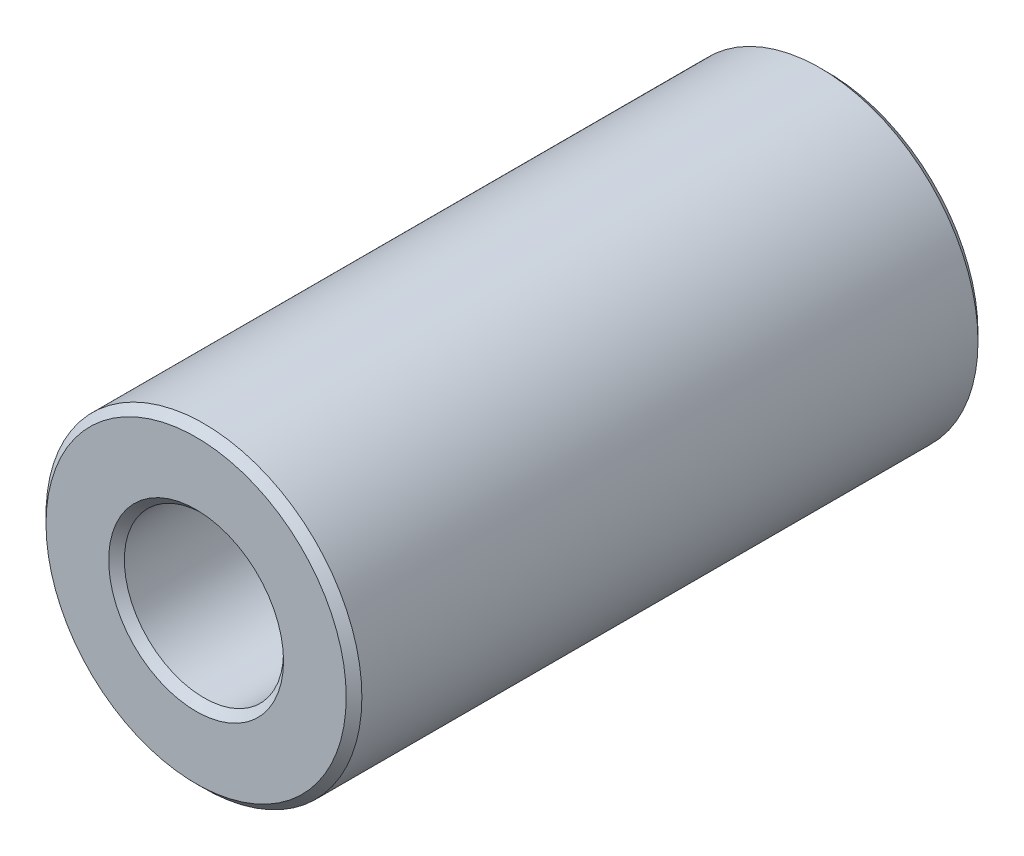
ISO-10303-21;
HEADER;
FILE_DESCRIPTION(('STEP AP214'),'2;1');
FILE_NAME('part.step','',(''),(''),'','','');
FILE_SCHEMA(('AUTOMOTIVE_DESIGN { 1 0 10303 214 1 1 1 1 }'));
ENDSEC;
DATA;
#1=APPLICATION_CONTEXT('core data for automotive mechanical design processes');
#2=APPLICATION_PROTOCOL_DEFINITION('international standard','automotive_design',2000,#1);
#3=PRODUCT_CONTEXT('',#1,'mechanical');
#4=PRODUCT('Part','Part','',(#3));
#5=PRODUCT_RELATED_PRODUCT_CATEGORY('part','',(#4));
#6=PRODUCT_DEFINITION_FORMATION('','',#4);
#7=PRODUCT_DEFINITION_CONTEXT('part definition',#1,'design');
#8=PRODUCT_DEFINITION('design','',#6,#7);
#9=PRODUCT_DEFINITION_SHAPE('','',#8);
#10=(LENGTH_UNIT() NAMED_UNIT(*) SI_UNIT(.MILLI.,.METRE.));
#11=(NAMED_UNIT(*) PLANE_ANGLE_UNIT() SI_UNIT($,.RADIAN.));
#12=(NAMED_UNIT(*) SI_UNIT($,.STERADIAN.) SOLID_ANGLE_UNIT());
#13=UNCERTAINTY_MEASURE_WITH_UNIT(LENGTH_MEASURE(1.E-05),#10,'distance_accuracy_value','');
#14=(GEOMETRIC_REPRESENTATION_CONTEXT(3) GLOBAL_UNCERTAINTY_ASSIGNED_CONTEXT((#13)) GLOBAL_UNIT_ASSIGNED_CONTEXT((#10,
#11,#12)) REPRESENTATION_CONTEXT('',''));
#15=CARTESIAN_POINT('',(0.,0.,0.));
#16=DIRECTION('',(0.,0.,1.));
#17=DIRECTION('',(1.,0.,0.));
#18=AXIS2_PLACEMENT_3D('',#15,#16,#17);
#19=CARTESIAN_POINT('',(0.,0.,-12.7));
#20=DIRECTION('',(0.,0.,1.));
#21=DIRECTION('',(1.,0.,0.));
#22=AXIS2_PLACEMENT_3D('',#19,#20,#21);
#23=CYLINDRICAL_SURFACE('',#22,6.35);
#24=CARTESIAN_POINT('',(0.,0.,12.38504));
#25=DIRECTION('',(0.,0.,1.));
#26=DIRECTION('',(1.,0.,0.));
#27=AXIS2_PLACEMENT_3D('',#24,#25,#26);
#28=CIRCLE('',#27,6.35);
#29=CARTESIAN_POINT('',(6.35,0.,12.38504));
#30=VERTEX_POINT('',#29);
#31=EDGE_CURVE('E55',#30,#30,#28,.F.);
#32=ORIENTED_EDGE('',*,*,#31,.T.);
#33=EDGE_LOOP('',(#32));
#34=FACE_BOUND('',#33,.T.);
#35=CARTESIAN_POINT('',(0.,0.,-12.38504));
#36=DIRECTION('',(0.,0.,1.));
#37=DIRECTION('',(1.,0.,0.));
#38=AXIS2_PLACEMENT_3D('',#35,#36,#37);
#39=CIRCLE('',#38,6.35);
#40=CARTESIAN_POINT('',(6.35,0.,-12.38504));
#41=VERTEX_POINT('',#40);
#42=EDGE_CURVE('E58',#41,#41,#39,.T.);
#43=ORIENTED_EDGE('',*,*,#42,.T.);
#44=EDGE_LOOP('',(#43));
#45=FACE_BOUND('',#44,.T.);
#46=ADVANCED_FACE('F35',(#34,#45),#23,.T.);
#47=CARTESIAN_POINT('',(0.,0.,-12.7));
#48=DIRECTION('',(0.,0.,1.));
#49=DIRECTION('',(1.,0.,0.));
#50=AXIS2_PLACEMENT_3D('',#47,#48,#49);
#51=PLANE('',#50);
#52=CARTESIAN_POINT('',(0.,0.,-12.7));
#53=DIRECTION('',(0.,0.,1.));
#54=DIRECTION('',(1.,0.,0.));
#55=AXIS2_PLACEMENT_3D('',#52,#53,#54);
#56=CIRCLE('',#55,6.03504);
#57=CARTESIAN_POINT('',(6.03504,0.,-12.7));
#58=VERTEX_POINT('',#57);
#59=EDGE_CURVE('E46',#58,#58,#56,.F.);
#60=ORIENTED_EDGE('',*,*,#59,.T.);
#61=EDGE_LOOP('',(#60));
#62=FACE_BOUND('',#61,.T.);
#63=CARTESIAN_POINT('',(0.,0.,-12.7));
#64=DIRECTION('',(0.,0.,1.));
#65=DIRECTION('',(1.,0.,0.));
#66=AXIS2_PLACEMENT_3D('',#63,#64,#65);
#67=CIRCLE('',#66,3.51536);
#68=CARTESIAN_POINT('',(3.51536,0.,-12.7));
#69=VERTEX_POINT('',#68);
#70=EDGE_CURVE('E50',#69,#69,#67,.T.);
#71=ORIENTED_EDGE('',*,*,#70,.T.);
#72=EDGE_LOOP('',(#71));
#73=FACE_BOUND('',#72,.T.);
#74=ADVANCED_FACE('F83',(#62,#73),#51,.F.);
#75=CARTESIAN_POINT('',(0.,0.,-12.7));
#76=DIRECTION('',(0.,0.,1.));
#77=DIRECTION('',(1.,0.,0.));
#78=AXIS2_PLACEMENT_3D('',#75,#76,#77);
#79=CYLINDRICAL_SURFACE('',#78,3.2004);
#80=CARTESIAN_POINT('',(0.,0.,12.38504));
#81=DIRECTION('',(0.,0.,1.));
#82=DIRECTION('',(1.,0.,0.));
#83=AXIS2_PLACEMENT_3D('',#80,#81,#82);
#84=CIRCLE('',#83,3.2004);
#85=CARTESIAN_POINT('',(3.2004,0.,12.38504));
#86=VERTEX_POINT('',#85);
#87=EDGE_CURVE('E10',#86,#86,#84,.T.);
#88=ORIENTED_EDGE('',*,*,#87,.T.);
#89=EDGE_LOOP('',(#88));
#90=FACE_BOUND('',#89,.T.);
#91=CARTESIAN_POINT('',(0.,0.,-12.38504));
#92=DIRECTION('',(0.,0.,1.));
#93=DIRECTION('',(1.,0.,0.));
#94=AXIS2_PLACEMENT_3D('',#91,#92,#93);
#95=CIRCLE('',#94,3.2004);
#96=CARTESIAN_POINT('',(3.2004,0.,-12.38504));
#97=VERTEX_POINT('',#96);
#98=EDGE_CURVE('E42',#97,#97,#95,.F.);
#99=ORIENTED_EDGE('',*,*,#98,.T.);
#100=EDGE_LOOP('',(#99));
#101=FACE_BOUND('',#100,.T.);
#102=ADVANCED_FACE('F89',(#90,#101),#79,.F.);
#103=CARTESIAN_POINT('',(0.,0.,12.7));
#104=DIRECTION('',(0.,0.,1.));
#105=DIRECTION('',(1.,0.,0.));
#106=AXIS2_PLACEMENT_3D('',#103,#104,#105);
#107=PLANE('',#106);
#108=CARTESIAN_POINT('',(0.,0.,12.7));
#109=DIRECTION('',(0.,0.,1.));
#110=DIRECTION('',(1.,0.,0.));
#111=AXIS2_PLACEMENT_3D('',#108,#109,#110);
#112=CIRCLE('',#111,6.03504000000001);
#113=CARTESIAN_POINT('',(6.03504000000001,0.,12.7));
#114=VERTEX_POINT('',#113);
#115=EDGE_CURVE('E61',#114,#114,#112,.T.);
#116=ORIENTED_EDGE('',*,*,#115,.T.);
#117=EDGE_LOOP('',(#116));
#118=FACE_BOUND('',#117,.T.);
#119=CARTESIAN_POINT('',(0.,0.,12.7));
#120=DIRECTION('',(0.,0.,1.));
#121=DIRECTION('',(1.,0.,0.));
#122=AXIS2_PLACEMENT_3D('',#119,#120,#121);
#123=CIRCLE('',#122,3.51536);
#124=CARTESIAN_POINT('',(3.51536,0.,12.7));
#125=VERTEX_POINT('',#124);
#126=EDGE_CURVE('E64',#125,#125,#123,.F.);
#127=ORIENTED_EDGE('',*,*,#126,.T.);
#128=EDGE_LOOP('',(#127));
#129=FACE_BOUND('',#128,.T.);
#130=ADVANCED_FACE('F68',(#118,#129),#107,.T.);
#131=CARTESIAN_POINT('',(0.,0.,12.7));
#132=DIRECTION('',(0.,0.,-1.));
#133=DIRECTION('',(-1.,0.,0.));
#134=AXIS2_PLACEMENT_3D('',#131,#132,#133);
#135=CONICAL_SURFACE('',#134,6.03504000000001,0.785398163397446);
#136=ORIENTED_EDGE('',*,*,#31,.F.);
#137=EDGE_LOOP('',(#136));
#138=FACE_BOUND('',#137,.T.);
#139=ORIENTED_EDGE('',*,*,#115,.F.);
#140=EDGE_LOOP('',(#139));
#141=FACE_BOUND('',#140,.T.);
#142=ADVANCED_FACE('F79',(#138,#141),#135,.T.);
#143=CARTESIAN_POINT('',(0.,0.,-12.38504));
#144=DIRECTION('',(0.,0.,1.));
#145=DIRECTION('',(1.,0.,0.));
#146=AXIS2_PLACEMENT_3D('',#143,#144,#145);
#147=CONICAL_SURFACE('',#146,6.35,0.785398163397451);
#148=ORIENTED_EDGE('',*,*,#59,.F.);
#149=EDGE_LOOP('',(#148));
#150=FACE_BOUND('',#149,.T.);
#151=ORIENTED_EDGE('',*,*,#42,.F.);
#152=EDGE_LOOP('',(#151));
#153=FACE_BOUND('',#152,.T.);
#154=ADVANCED_FACE('F73',(#150,#153),#147,.T.);
#155=CARTESIAN_POINT('',(0.,0.,12.38504));
#156=DIRECTION('',(0.,0.,1.));
#157=DIRECTION('',(1.,0.,0.));
#158=AXIS2_PLACEMENT_3D('',#155,#156,#157);
#159=CONICAL_SURFACE('',#158,3.2004,0.785398163397453);
#160=ORIENTED_EDGE('',*,*,#126,.F.);
#161=EDGE_LOOP('',(#160));
#162=FACE_BOUND('',#161,.T.);
#163=ORIENTED_EDGE('',*,*,#87,.F.);
#164=EDGE_LOOP('',(#163));
#165=FACE_BOUND('',#164,.T.);
#166=ADVANCED_FACE('F70',(#162,#165),#159,.F.);
#167=CARTESIAN_POINT('',(0.,0.,-12.7));
#168=DIRECTION('',(0.,0.,-1.));
#169=DIRECTION('',(-1.,0.,0.));
#170=AXIS2_PLACEMENT_3D('',#167,#168,#169);
#171=CONICAL_SURFACE('',#170,3.51536,0.78539816339745);
#172=ORIENTED_EDGE('',*,*,#98,.F.);
#173=EDGE_LOOP('',(#172));
#174=FACE_BOUND('',#173,.T.);
#175=ORIENTED_EDGE('',*,*,#70,.F.);
#176=EDGE_LOOP('',(#175));
#177=FACE_BOUND('',#176,.T.);
#178=ADVANCED_FACE('F37',(#174,#177),#171,.F.);
#179=CLOSED_SHELL('',(#46,#74,#102,#130,#142,#154,#166,#178));
#180=MANIFOLD_SOLID_BREP('B2',#179);
#181=ADVANCED_BREP_SHAPE_REPRESENTATION('',(#18,#180),#14);
#182=SHAPE_DEFINITION_REPRESENTATION(#9,#181);
ENDSEC;
END-ISO-10303-21;
